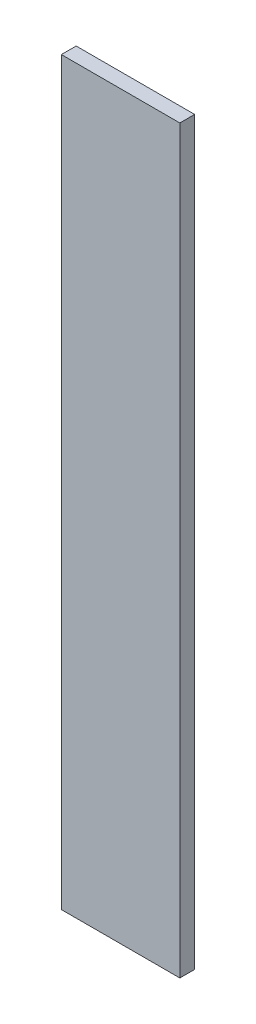
ISO-10303-21;
HEADER;
FILE_DESCRIPTION(('STEP AP214'),'2;1');
FILE_NAME('part.step','',(''),(''),'','','');
FILE_SCHEMA(('AUTOMOTIVE_DESIGN { 1 0 10303 214 1 1 1 1 }'));
ENDSEC;
DATA;
#1=APPLICATION_CONTEXT('core data for automotive mechanical design processes');
#2=APPLICATION_PROTOCOL_DEFINITION('international standard','automotive_design',2000,#1);
#3=PRODUCT_CONTEXT('',#1,'mechanical');
#4=PRODUCT('Part','Part','',(#3));
#5=PRODUCT_RELATED_PRODUCT_CATEGORY('part','',(#4));
#6=PRODUCT_DEFINITION_FORMATION('','',#4);
#7=PRODUCT_DEFINITION_CONTEXT('part definition',#1,'design');
#8=PRODUCT_DEFINITION('design','',#6,#7);
#9=PRODUCT_DEFINITION_SHAPE('','',#8);
#10=(LENGTH_UNIT() NAMED_UNIT(*) SI_UNIT(.MILLI.,.METRE.));
#11=(NAMED_UNIT(*) PLANE_ANGLE_UNIT() SI_UNIT($,.RADIAN.));
#12=(NAMED_UNIT(*) SI_UNIT($,.STERADIAN.) SOLID_ANGLE_UNIT());
#13=UNCERTAINTY_MEASURE_WITH_UNIT(LENGTH_MEASURE(1.E-05),#10,'distance_accuracy_value','');
#14=(GEOMETRIC_REPRESENTATION_CONTEXT(3) GLOBAL_UNCERTAINTY_ASSIGNED_CONTEXT((#13)) GLOBAL_UNIT_ASSIGNED_CONTEXT((#10,
#11,#12)) REPRESENTATION_CONTEXT('',''));
#15=CARTESIAN_POINT('',(0.,0.,0.));
#16=DIRECTION('',(0.,0.,1.));
#17=DIRECTION('',(1.,0.,0.));
#18=AXIS2_PLACEMENT_3D('',#15,#16,#17);
#19=CARTESIAN_POINT('',(-269.999999999997,-857.462689126393,-30.));
#20=DIRECTION('',(1.,0.,0.));
#21=DIRECTION('',(0.,0.,-1.));
#22=AXIS2_PLACEMENT_3D('',#19,#20,#21);
#23=PLANE('',#22);
#24=DIRECTION('',(0.,1.,0.));
#25=VECTOR('',#24,1.);
#26=CARTESIAN_POINT('',(-269.999999999997,-857.462689126393,0.));
#27=LINE('',#26,#25);
#28=CARTESIAN_POINT('',(-269.999999999997,-857.462689126393,0.));
#29=VERTEX_POINT('',#28);
#30=CARTESIAN_POINT('',(-269.999999999997,642.537310873607,0.));
#31=VERTEX_POINT('',#30);
#32=EDGE_CURVE('E113',#29,#31,#27,.T.);
#33=ORIENTED_EDGE('',*,*,#32,.T.);
#34=DIRECTION('',(0.,0.,1.));
#35=VECTOR('',#34,1.);
#36=CARTESIAN_POINT('',(-269.999999999997,642.537310873607,-30.));
#37=LINE('',#36,#35);
#38=CARTESIAN_POINT('',(-269.999999999997,642.537310873607,-30.));
#39=VERTEX_POINT('',#38);
#40=EDGE_CURVE('E11',#39,#31,#37,.T.);
#41=ORIENTED_EDGE('',*,*,#40,.F.);
#42=DIRECTION('',(0.,1.,0.));
#43=VECTOR('',#42,1.);
#44=CARTESIAN_POINT('',(-269.999999999997,-857.462689126393,-30.));
#45=LINE('',#44,#43);
#46=CARTESIAN_POINT('',(-269.999999999997,-857.462689126393,-30.));
#47=VERTEX_POINT('',#46);
#48=EDGE_CURVE('E95',#47,#39,#45,.T.);
#49=ORIENTED_EDGE('',*,*,#48,.F.);
#50=DIRECTION('',(0.,0.,1.));
#51=VECTOR('',#50,1.);
#52=CARTESIAN_POINT('',(-269.999999999997,-857.462689126393,-30.));
#53=LINE('',#52,#51);
#54=EDGE_CURVE('E62',#47,#29,#53,.T.);
#55=ORIENTED_EDGE('',*,*,#54,.T.);
#56=EDGE_LOOP('',(#33,#41,#49,#55));
#57=FACE_BOUND('',#56,.T.);
#58=ADVANCED_FACE('F45',(#57),#23,.F.);
#59=CARTESIAN_POINT('',(-269.999999999997,642.537310873607,-30.));
#60=DIRECTION('',(0.,-1.,0.));
#61=DIRECTION('',(0.,0.,-1.));
#62=AXIS2_PLACEMENT_3D('',#59,#60,#61);
#63=PLANE('',#62);
#64=DIRECTION('',(1.,0.,0.));
#65=VECTOR('',#64,1.);
#66=CARTESIAN_POINT('',(-269.999999999997,642.537310873607,0.));
#67=LINE('',#66,#65);
#68=CARTESIAN_POINT('',(-29.9999999999973,642.537310873607,0.));
#69=VERTEX_POINT('',#68);
#70=EDGE_CURVE('E101',#31,#69,#67,.T.);
#71=ORIENTED_EDGE('',*,*,#70,.T.);
#72=DIRECTION('',(0.,0.,1.));
#73=VECTOR('',#72,1.);
#74=CARTESIAN_POINT('',(-29.9999999999973,642.537310873607,-30.));
#75=LINE('',#74,#73);
#76=CARTESIAN_POINT('',(-29.9999999999973,642.537310873607,-30.));
#77=VERTEX_POINT('',#76);
#78=EDGE_CURVE('E54',#77,#69,#75,.T.);
#79=ORIENTED_EDGE('',*,*,#78,.F.);
#80=DIRECTION('',(1.,0.,0.));
#81=VECTOR('',#80,1.);
#82=CARTESIAN_POINT('',(-269.999999999997,642.537310873607,-30.));
#83=LINE('',#82,#81);
#84=EDGE_CURVE('E87',#39,#77,#83,.T.);
#85=ORIENTED_EDGE('',*,*,#84,.F.);
#86=ORIENTED_EDGE('',*,*,#40,.T.);
#87=EDGE_LOOP('',(#71,#79,#85,#86));
#88=FACE_BOUND('',#87,.T.);
#89=ADVANCED_FACE('F100',(#88),#63,.F.);
#90=CARTESIAN_POINT('',(-29.9999999999973,-857.462689126393,-30.));
#91=DIRECTION('',(1.,0.,0.));
#92=DIRECTION('',(0.,0.,-1.));
#93=AXIS2_PLACEMENT_3D('',#90,#91,#92);
#94=PLANE('',#93);
#95=DIRECTION('',(0.,1.,0.));
#96=VECTOR('',#95,1.);
#97=CARTESIAN_POINT('',(-29.9999999999973,-857.462689126393,0.));
#98=LINE('',#97,#96);
#99=CARTESIAN_POINT('',(-29.9999999999973,-857.462689126393,0.));
#100=VERTEX_POINT('',#99);
#101=EDGE_CURVE('E118',#100,#69,#98,.T.);
#102=ORIENTED_EDGE('',*,*,#101,.F.);
#103=DIRECTION('',(0.,0.,1.));
#104=VECTOR('',#103,1.);
#105=CARTESIAN_POINT('',(-29.9999999999973,-857.462689126393,-30.));
#106=LINE('',#105,#104);
#107=CARTESIAN_POINT('',(-29.9999999999973,-857.462689126393,-30.));
#108=VERTEX_POINT('',#107);
#109=EDGE_CURVE('E76',#108,#100,#106,.T.);
#110=ORIENTED_EDGE('',*,*,#109,.F.);
#111=DIRECTION('',(0.,1.,0.));
#112=VECTOR('',#111,1.);
#113=CARTESIAN_POINT('',(-29.9999999999973,-857.462689126393,-30.));
#114=LINE('',#113,#112);
#115=EDGE_CURVE('E94',#108,#77,#114,.T.);
#116=ORIENTED_EDGE('',*,*,#115,.T.);
#117=ORIENTED_EDGE('',*,*,#78,.T.);
#118=EDGE_LOOP('',(#102,#110,#116,#117));
#119=FACE_BOUND('',#118,.T.);
#120=ADVANCED_FACE('F105',(#119),#94,.T.);
#121=CARTESIAN_POINT('',(-269.999999999997,-857.462689126393,-30.));
#122=DIRECTION('',(0.,-1.,0.));
#123=DIRECTION('',(1.,0.,0.));
#124=AXIS2_PLACEMENT_3D('',#121,#122,#123);
#125=PLANE('',#124);
#126=DIRECTION('',(1.,0.,0.));
#127=VECTOR('',#126,1.);
#128=CARTESIAN_POINT('',(-269.999999999997,-857.462689126393,0.));
#129=LINE('',#128,#127);
#130=EDGE_CURVE('E121',#29,#100,#129,.T.);
#131=ORIENTED_EDGE('',*,*,#130,.F.);
#132=ORIENTED_EDGE('',*,*,#54,.F.);
#133=DIRECTION('',(1.,0.,0.));
#134=VECTOR('',#133,1.);
#135=CARTESIAN_POINT('',(-269.999999999997,-857.462689126393,-30.));
#136=LINE('',#135,#134);
#137=EDGE_CURVE('E107',#47,#108,#136,.T.);
#138=ORIENTED_EDGE('',*,*,#137,.T.);
#139=ORIENTED_EDGE('',*,*,#109,.T.);
#140=EDGE_LOOP('',(#131,#132,#138,#139));
#141=FACE_BOUND('',#140,.T.);
#142=ADVANCED_FACE('F131',(#141),#125,.T.);
#143=CARTESIAN_POINT('',(0.,0.,-30.));
#144=DIRECTION('',(0.,0.,-1.));
#145=DIRECTION('',(-1.,0.,0.));
#146=AXIS2_PLACEMENT_3D('',#143,#144,#145);
#147=PLANE('',#146);
#148=ORIENTED_EDGE('',*,*,#48,.T.);
#149=ORIENTED_EDGE('',*,*,#84,.T.);
#150=ORIENTED_EDGE('',*,*,#115,.F.);
#151=ORIENTED_EDGE('',*,*,#137,.F.);
#152=EDGE_LOOP('',(#148,#149,#150,#151));
#153=FACE_BOUND('',#152,.T.);
#154=ADVANCED_FACE('F91',(#153),#147,.T.);
#155=CARTESIAN_POINT('',(0.,0.,0.));
#156=DIRECTION('',(0.,0.,-1.));
#157=DIRECTION('',(-1.,0.,0.));
#158=AXIS2_PLACEMENT_3D('',#155,#156,#157);
#159=PLANE('',#158);
#160=ORIENTED_EDGE('',*,*,#32,.F.);
#161=ORIENTED_EDGE('',*,*,#130,.T.);
#162=ORIENTED_EDGE('',*,*,#101,.T.);
#163=ORIENTED_EDGE('',*,*,#70,.F.);
#164=EDGE_LOOP('',(#160,#161,#162,#163));
#165=FACE_BOUND('',#164,.T.);
#166=ADVANCED_FACE('F130',(#165),#159,.F.);
#167=CLOSED_SHELL('',(#58,#89,#120,#142,#154,#166));
#168=MANIFOLD_SOLID_BREP('B2',#167);
#169=ADVANCED_BREP_SHAPE_REPRESENTATION('',(#18,#168),#14);
#170=SHAPE_DEFINITION_REPRESENTATION(#9,#169);
ENDSEC;
END-ISO-10303-21;
